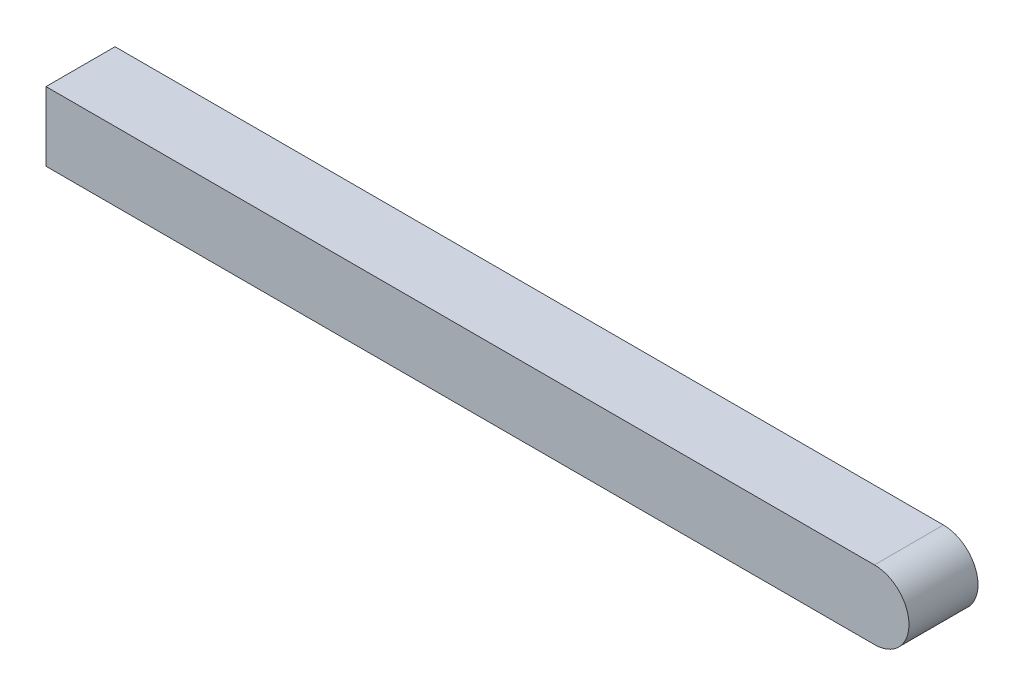
ISO-10303-21;
HEADER;
FILE_DESCRIPTION(('STEP AP214'),'2;1');
FILE_NAME('part.step','',(''),(''),'','','');
FILE_SCHEMA(('AUTOMOTIVE_DESIGN { 1 0 10303 214 1 1 1 1 }'));
ENDSEC;
DATA;
#1=APPLICATION_CONTEXT('core data for automotive mechanical design processes');
#2=APPLICATION_PROTOCOL_DEFINITION('international standard','automotive_design',2000,#1);
#3=PRODUCT_CONTEXT('',#1,'mechanical');
#4=PRODUCT('Part','Part','',(#3));
#5=PRODUCT_RELATED_PRODUCT_CATEGORY('part','',(#4));
#6=PRODUCT_DEFINITION_FORMATION('','',#4);
#7=PRODUCT_DEFINITION_CONTEXT('part definition',#1,'design');
#8=PRODUCT_DEFINITION('design','',#6,#7);
#9=PRODUCT_DEFINITION_SHAPE('','',#8);
#10=(LENGTH_UNIT() NAMED_UNIT(*) SI_UNIT(.MILLI.,.METRE.));
#11=(NAMED_UNIT(*) PLANE_ANGLE_UNIT() SI_UNIT($,.RADIAN.));
#12=(NAMED_UNIT(*) SI_UNIT($,.STERADIAN.) SOLID_ANGLE_UNIT());
#13=UNCERTAINTY_MEASURE_WITH_UNIT(LENGTH_MEASURE(1.E-05),#10,'distance_accuracy_value','');
#14=(GEOMETRIC_REPRESENTATION_CONTEXT(3) GLOBAL_UNCERTAINTY_ASSIGNED_CONTEXT((#13)) GLOBAL_UNIT_ASSIGNED_CONTEXT((#10,
#11,#12)) REPRESENTATION_CONTEXT('',''));
#15=CARTESIAN_POINT('',(0.,0.,0.));
#16=DIRECTION('',(0.,0.,1.));
#17=DIRECTION('',(1.,0.,0.));
#18=AXIS2_PLACEMENT_3D('',#15,#16,#17);
#19=CARTESIAN_POINT('',(-11.1072918740804,-0.483723240323878,1.));
#20=DIRECTION('',(-1.,0.,0.));
#21=DIRECTION('',(0.,0.,1.));
#22=AXIS2_PLACEMENT_3D('',#19,#20,#21);
#23=PLANE('',#22);
#24=DIRECTION('',(0.,1.,0.));
#25=VECTOR('',#24,1.);
#26=CARTESIAN_POINT('',(-11.1072918740804,-0.483723240323878,0.));
#27=LINE('',#26,#25);
#28=CARTESIAN_POINT('',(-11.1072918740804,-0.483723240323878,0.));
#29=VERTEX_POINT('',#28);
#30=CARTESIAN_POINT('',(-11.1072918740804,0.516276759676122,0.));
#31=VERTEX_POINT('',#30);
#32=EDGE_CURVE('E104',#29,#31,#27,.T.);
#33=ORIENTED_EDGE('',*,*,#32,.F.);
#34=DIRECTION('',(0.,0.,-1.));
#35=VECTOR('',#34,1.);
#36=CARTESIAN_POINT('',(-11.1072918740804,-0.483723240323878,1.));
#37=LINE('',#36,#35);
#38=CARTESIAN_POINT('',(-11.1072918740804,-0.483723240323878,1.));
#39=VERTEX_POINT('',#38);
#40=EDGE_CURVE('E11',#39,#29,#37,.T.);
#41=ORIENTED_EDGE('',*,*,#40,.F.);
#42=DIRECTION('',(0.,1.,0.));
#43=VECTOR('',#42,1.);
#44=CARTESIAN_POINT('',(-11.1072918740804,-0.483723240323878,1.));
#45=LINE('',#44,#43);
#46=CARTESIAN_POINT('',(-11.1072918740804,0.516276759676122,1.));
#47=VERTEX_POINT('',#46);
#48=EDGE_CURVE('E99',#39,#47,#45,.T.);
#49=ORIENTED_EDGE('',*,*,#48,.T.);
#50=DIRECTION('',(0.,0.,-1.));
#51=VECTOR('',#50,1.);
#52=CARTESIAN_POINT('',(-11.1072918740804,0.516276759676122,1.));
#53=LINE('',#52,#51);
#54=EDGE_CURVE('E42',#47,#31,#53,.T.);
#55=ORIENTED_EDGE('',*,*,#54,.T.);
#56=EDGE_LOOP('',(#33,#41,#49,#55));
#57=FACE_BOUND('',#56,.T.);
#58=ADVANCED_FACE('F39',(#57),#23,.T.);
#59=CARTESIAN_POINT('',(-11.1072918740804,-0.483723240323878,1.));
#60=DIRECTION('',(0.,1.,0.));
#61=DIRECTION('',(0.,0.,1.));
#62=AXIS2_PLACEMENT_3D('',#59,#60,#61);
#63=PLANE('',#62);
#64=DIRECTION('',(1.,0.,0.));
#65=VECTOR('',#64,1.);
#66=CARTESIAN_POINT('',(-11.1072918740804,-0.483723240323878,0.));
#67=LINE('',#66,#65);
#68=CARTESIAN_POINT('',(0.892708125919603,-0.483723240323878,0.));
#69=VERTEX_POINT('',#68);
#70=EDGE_CURVE('E72',#29,#69,#67,.T.);
#71=ORIENTED_EDGE('',*,*,#70,.T.);
#72=DIRECTION('',(0.,0.,-1.));
#73=VECTOR('',#72,1.);
#74=CARTESIAN_POINT('',(0.892708125919603,-0.483723240323878,1.));
#75=LINE('',#74,#73);
#76=CARTESIAN_POINT('',(0.892708125919603,-0.483723240323878,1.));
#77=VERTEX_POINT('',#76);
#78=EDGE_CURVE('E48',#77,#69,#75,.T.);
#79=ORIENTED_EDGE('',*,*,#78,.F.);
#80=DIRECTION('',(1.,0.,0.));
#81=VECTOR('',#80,1.);
#82=CARTESIAN_POINT('',(-11.1072918740804,-0.483723240323878,1.));
#83=LINE('',#82,#81);
#84=EDGE_CURVE('E89',#39,#77,#83,.T.);
#85=ORIENTED_EDGE('',*,*,#84,.F.);
#86=ORIENTED_EDGE('',*,*,#40,.T.);
#87=EDGE_LOOP('',(#71,#79,#85,#86));
#88=FACE_BOUND('',#87,.T.);
#89=ADVANCED_FACE('F114',(#88),#63,.F.);
#90=CARTESIAN_POINT('',(0.892708125919603,0.0162767596761223,1.));
#91=DIRECTION('',(0.,0.,-1.));
#92=DIRECTION('',(-1.,0.,0.));
#93=AXIS2_PLACEMENT_3D('',#90,#91,#92);
#94=CYLINDRICAL_SURFACE('',#93,0.5);
#95=CARTESIAN_POINT('',(0.892708125919603,0.0162767596761223,0.));
#96=DIRECTION('',(0.,0.,1.));
#97=DIRECTION('',(1.,0.,0.));
#98=AXIS2_PLACEMENT_3D('',#95,#96,#97);
#99=CIRCLE('',#98,0.5);
#100=CARTESIAN_POINT('',(0.892708125919603,0.516276759676122,0.));
#101=VERTEX_POINT('',#100);
#102=EDGE_CURVE('E96',#69,#101,#99,.T.);
#103=ORIENTED_EDGE('',*,*,#102,.T.);
#104=DIRECTION('',(0.,0.,-1.));
#105=VECTOR('',#104,1.);
#106=CARTESIAN_POINT('',(0.892708125919603,0.516276759676122,1.));
#107=LINE('',#106,#105);
#108=CARTESIAN_POINT('',(0.892708125919603,0.516276759676122,1.));
#109=VERTEX_POINT('',#108);
#110=EDGE_CURVE('E93',#109,#101,#107,.T.);
#111=ORIENTED_EDGE('',*,*,#110,.F.);
#112=CARTESIAN_POINT('',(0.892708125919603,0.0162767596761223,1.));
#113=DIRECTION('',(0.,0.,1.));
#114=DIRECTION('',(1.,0.,0.));
#115=AXIS2_PLACEMENT_3D('',#112,#113,#114);
#116=CIRCLE('',#115,0.5);
#117=EDGE_CURVE('E84',#77,#109,#116,.T.);
#118=ORIENTED_EDGE('',*,*,#117,.F.);
#119=ORIENTED_EDGE('',*,*,#78,.T.);
#120=EDGE_LOOP('',(#103,#111,#118,#119));
#121=FACE_BOUND('',#120,.T.);
#122=ADVANCED_FACE('F94',(#121),#94,.T.);
#123=CARTESIAN_POINT('',(-11.1072918740804,0.516276759676122,1.));
#124=DIRECTION('',(0.,1.,0.));
#125=DIRECTION('',(0.,0.,1.));
#126=AXIS2_PLACEMENT_3D('',#123,#124,#125);
#127=PLANE('',#126);
#128=DIRECTION('',(1.,0.,0.));
#129=VECTOR('',#128,1.);
#130=CARTESIAN_POINT('',(-11.1072918740804,0.516276759676122,0.));
#131=LINE('',#130,#129);
#132=EDGE_CURVE('E107',#31,#101,#131,.T.);
#133=ORIENTED_EDGE('',*,*,#132,.F.);
#134=ORIENTED_EDGE('',*,*,#54,.F.);
#135=DIRECTION('',(1.,0.,0.));
#136=VECTOR('',#135,1.);
#137=CARTESIAN_POINT('',(-11.1072918740804,0.516276759676122,1.));
#138=LINE('',#137,#136);
#139=EDGE_CURVE('E88',#47,#109,#138,.T.);
#140=ORIENTED_EDGE('',*,*,#139,.T.);
#141=ORIENTED_EDGE('',*,*,#110,.T.);
#142=EDGE_LOOP('',(#133,#134,#140,#141));
#143=FACE_BOUND('',#142,.T.);
#144=ADVANCED_FACE('F98',(#143),#127,.T.);
#145=CARTESIAN_POINT('',(0.892708125919603,0.0162767596761223,1.));
#146=DIRECTION('',(0.,0.,1.));
#147=DIRECTION('',(1.,0.,0.));
#148=AXIS2_PLACEMENT_3D('',#145,#146,#147);
#149=PLANE('',#148);
#150=ORIENTED_EDGE('',*,*,#48,.F.);
#151=ORIENTED_EDGE('',*,*,#84,.T.);
#152=ORIENTED_EDGE('',*,*,#117,.T.);
#153=ORIENTED_EDGE('',*,*,#139,.F.);
#154=EDGE_LOOP('',(#150,#151,#152,#153));
#155=FACE_BOUND('',#154,.T.);
#156=ADVANCED_FACE('F87',(#155),#149,.T.);
#157=CARTESIAN_POINT('',(0.892708125919603,0.0162767596761223,0.));
#158=DIRECTION('',(0.,0.,1.));
#159=DIRECTION('',(1.,0.,0.));
#160=AXIS2_PLACEMENT_3D('',#157,#158,#159);
#161=PLANE('',#160);
#162=ORIENTED_EDGE('',*,*,#32,.T.);
#163=ORIENTED_EDGE('',*,*,#132,.T.);
#164=ORIENTED_EDGE('',*,*,#102,.F.);
#165=ORIENTED_EDGE('',*,*,#70,.F.);
#166=EDGE_LOOP('',(#162,#163,#164,#165));
#167=FACE_BOUND('',#166,.T.);
#168=ADVANCED_FACE('F112',(#167),#161,.F.);
#169=CLOSED_SHELL('',(#58,#89,#122,#144,#156,#168));
#170=MANIFOLD_SOLID_BREP('B2',#169);
#171=ADVANCED_BREP_SHAPE_REPRESENTATION('',(#18,#170),#14);
#172=SHAPE_DEFINITION_REPRESENTATION(#9,#171);
ENDSEC;
END-ISO-10303-21;
